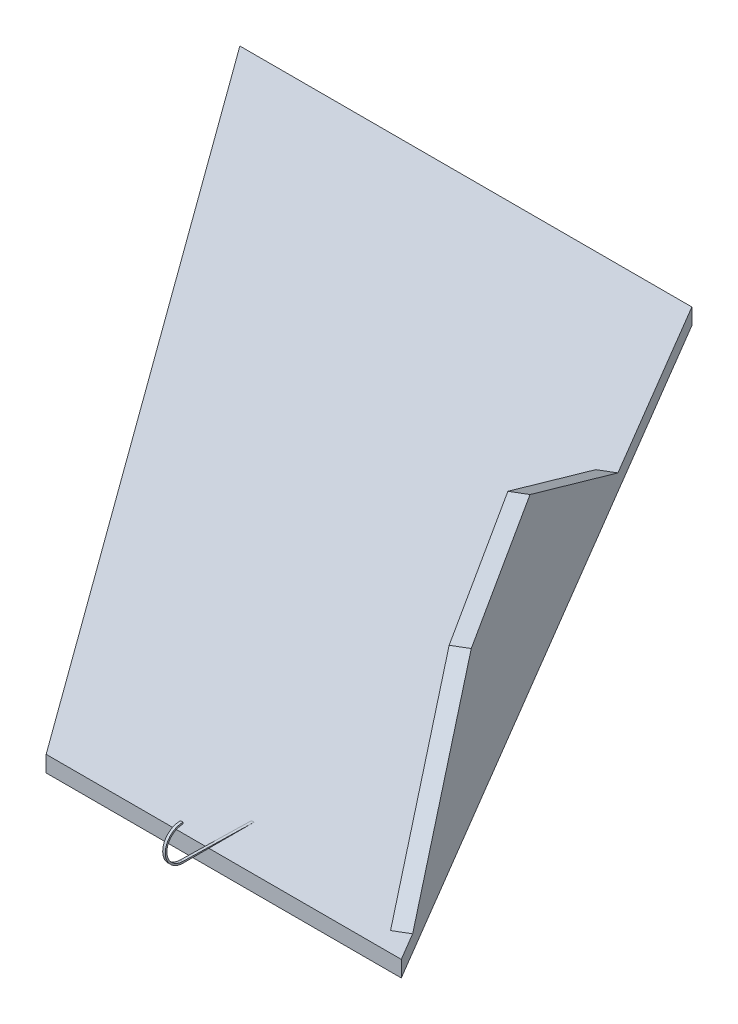
ISO-10303-21;
HEADER;
FILE_DESCRIPTION(('STEP AP214'),'2;1');
FILE_NAME('part.step','',(''),(''),'','','');
FILE_SCHEMA(('AUTOMOTIVE_DESIGN { 1 0 10303 214 1 1 1 1 }'));
ENDSEC;
DATA;
#1=APPLICATION_CONTEXT('core data for automotive mechanical design processes');
#2=APPLICATION_PROTOCOL_DEFINITION('international standard','automotive_design',2000,#1);
#3=PRODUCT_CONTEXT('',#1,'mechanical');
#4=PRODUCT('Part','Part','',(#3));
#5=PRODUCT_RELATED_PRODUCT_CATEGORY('part','',(#4));
#6=PRODUCT_DEFINITION_FORMATION('','',#4);
#7=PRODUCT_DEFINITION_CONTEXT('part definition',#1,'design');
#8=PRODUCT_DEFINITION('design','',#6,#7);
#9=PRODUCT_DEFINITION_SHAPE('','',#8);
#10=(LENGTH_UNIT() NAMED_UNIT(*) SI_UNIT(.MILLI.,.METRE.));
#11=(NAMED_UNIT(*) PLANE_ANGLE_UNIT() SI_UNIT($,.RADIAN.));
#12=(NAMED_UNIT(*) SI_UNIT($,.STERADIAN.) SOLID_ANGLE_UNIT());
#13=UNCERTAINTY_MEASURE_WITH_UNIT(LENGTH_MEASURE(1.E-05),#10,'distance_accuracy_value','');
#14=(GEOMETRIC_REPRESENTATION_CONTEXT(3) GLOBAL_UNCERTAINTY_ASSIGNED_CONTEXT((#13)) GLOBAL_UNIT_ASSIGNED_CONTEXT((#10,
#11,#12)) REPRESENTATION_CONTEXT('',''));
#15=CARTESIAN_POINT('',(0.,0.,0.));
#16=DIRECTION('',(0.,0.,1.));
#17=DIRECTION('',(1.,0.,0.));
#18=AXIS2_PLACEMENT_3D('',#15,#16,#17);
#19=CARTESIAN_POINT('',(0.,6.35,0.));
#20=DIRECTION('',(0.,-1.,0.));
#21=DIRECTION('',(0.,0.,-1.));
#22=AXIS2_PLACEMENT_3D('',#19,#20,#21);
#23=PLANE('',#22);
#24=DIRECTION('',(-0.508729312126642,0.,-0.860926528214315));
#25=VECTOR('',#24,1.);
#26=CARTESIAN_POINT('',(254.155589586524,6.35,-150.182848392037));
#27=LINE('',#26,#25);
#28=CARTESIAN_POINT('',(342.9,6.35000000000002,0.));
#29=VERTEX_POINT('',#28);
#30=CARTESIAN_POINT('',(336.439137735992,6.35,-10.933766908322));
#31=VERTEX_POINT('',#30);
#32=EDGE_CURVE('E180',#29,#31,#27,.T.);
#33=ORIENTED_EDGE('',*,*,#32,.T.);
#34=DIRECTION('',(0.860926528214315,0.,-0.508729312126642));
#35=VECTOR('',#34,1.);
#36=CARTESIAN_POINT('',(330.972254281831,6.35000000000002,-7.70333577631764));
#37=LINE('',#36,#35);
#38=CARTESIAN_POINT('',(330.972254281831,6.35,-7.70333577631765));
#39=VERTEX_POINT('',#38);
#40=EDGE_CURVE('E151',#39,#31,#37,.T.);
#41=ORIENTED_EDGE('',*,*,#40,.F.);
#42=DIRECTION('',(-0.508729312126641,0.,-0.860926528214315));
#43=VECTOR('',#42,1.);
#44=CARTESIAN_POINT('',(330.972254281831,6.35000000000002,-7.70333577631764));
#45=LINE('',#44,#43);
#46=CARTESIAN_POINT('',(214.328721261893,6.35,-205.100083963904));
#47=VERTEX_POINT('',#46);
#48=EDGE_CURVE('E152',#39,#47,#45,.T.);
#49=ORIENTED_EDGE('',*,*,#48,.T.);
#50=DIRECTION('',(0.860926528214315,0.,-0.508729312126642));
#51=VECTOR('',#50,1.);
#52=CARTESIAN_POINT('',(214.328721261893,6.35000000000002,-205.100083963904));
#53=LINE('',#52,#51);
#54=CARTESIAN_POINT('',(219.795604716054,6.35000000000002,-208.330515095908));
#55=VERTEX_POINT('',#54);
#56=EDGE_CURVE('E161',#47,#55,#53,.T.);
#57=ORIENTED_EDGE('',*,*,#56,.T.);
#58=CARTESIAN_POINT('',(177.8,6.35000000000002,-279.4));
#59=VERTEX_POINT('',#58);
#60=EDGE_CURVE('E177',#55,#59,#27,.T.);
#61=ORIENTED_EDGE('',*,*,#60,.T.);
#62=DIRECTION('',(1.,0.,0.));
#63=VECTOR('',#62,1.);
#64=CARTESIAN_POINT('',(0.,6.35,-279.4));
#65=LINE('',#64,#63);
#66=CARTESIAN_POINT('',(0.,6.35000000000002,-279.4));
#67=VERTEX_POINT('',#66);
#68=EDGE_CURVE('E224',#67,#59,#65,.T.);
#69=ORIENTED_EDGE('',*,*,#68,.F.);
#70=DIRECTION('',(0.588171697675046,0.,0.808736084303189));
#71=VECTOR('',#70,1.);
#72=CARTESIAN_POINT('',(132.903783783784,6.35,-96.6572972972973));
#73=LINE('',#72,#71);
#74=CARTESIAN_POINT('',(203.2,6.35000000000002,0.));
#75=VERTEX_POINT('',#74);
#76=EDGE_CURVE('E168',#67,#75,#73,.T.);
#77=ORIENTED_EDGE('',*,*,#76,.T.);
#78=DIRECTION('',(1.,0.,0.));
#79=VECTOR('',#78,1.);
#80=CARTESIAN_POINT('',(0.,6.35,0.));
#81=LINE('',#80,#79);
#82=CARTESIAN_POINT('',(266.192,6.35,0.));
#83=VERTEX_POINT('',#82);
#84=EDGE_CURVE('E229',#75,#83,#81,.T.);
#85=ORIENTED_EDGE('',*,*,#84,.T.);
#86=DIRECTION('',(0.,0.,1.));
#87=VECTOR('',#86,1.);
#88=CARTESIAN_POINT('',(266.192,6.35,-17.78));
#89=LINE('',#88,#87);
#90=CARTESIAN_POINT('',(266.192,6.35,-17.78));
#91=VERTEX_POINT('',#90);
#92=EDGE_CURVE('E185',#91,#83,#89,.T.);
#93=ORIENTED_EDGE('',*,*,#92,.F.);
#94=DIRECTION('',(-1.,0.,0.));
#95=VECTOR('',#94,1.);
#96=CARTESIAN_POINT('',(267.208,6.35,-17.78));
#97=LINE('',#96,#95);
#98=CARTESIAN_POINT('',(267.208,6.35,-17.78));
#99=VERTEX_POINT('',#98);
#100=EDGE_CURVE('E211',#99,#91,#97,.T.);
#101=ORIENTED_EDGE('',*,*,#100,.F.);
#102=DIRECTION('',(0.,0.,1.));
#103=VECTOR('',#102,1.);
#104=CARTESIAN_POINT('',(267.208,6.35,-17.78));
#105=LINE('',#104,#103);
#106=CARTESIAN_POINT('',(267.208,6.35,0.));
#107=VERTEX_POINT('',#106);
#108=EDGE_CURVE('E201',#99,#107,#105,.T.);
#109=ORIENTED_EDGE('',*,*,#108,.T.);
#110=EDGE_CURVE('E227',#107,#29,#81,.T.);
#111=ORIENTED_EDGE('',*,*,#110,.T.);
#112=EDGE_LOOP('',(#33,#41,#49,#57,#61,#69,#77,#85,#93,#101,#109,#111));
#113=FACE_BOUND('',#112,.T.);
#114=ADVANCED_FACE('F37',(#113),#23,.F.);
#115=CARTESIAN_POINT('',(0.,6.35,0.));
#116=DIRECTION('',(0.,0.,-1.));
#117=DIRECTION('',(-1.,0.,0.));
#118=AXIS2_PLACEMENT_3D('',#115,#116,#117);
#119=PLANE('',#118);
#120=ORIENTED_EDGE('',*,*,#84,.F.);
#121=DIRECTION('',(0.,-1.,0.));
#122=VECTOR('',#121,1.);
#123=CARTESIAN_POINT('',(203.2,76.2,0.));
#124=LINE('',#123,#122);
#125=CARTESIAN_POINT('',(203.2,0.,0.));
#126=VERTEX_POINT('',#125);
#127=EDGE_CURVE('E165',#75,#126,#124,.T.);
#128=ORIENTED_EDGE('',*,*,#127,.T.);
#129=DIRECTION('',(1.,0.,0.));
#130=VECTOR('',#129,1.);
#131=CARTESIAN_POINT('',(0.,0.,0.));
#132=LINE('',#131,#130);
#133=CARTESIAN_POINT('',(342.9,0.,0.));
#134=VERTEX_POINT('',#133);
#135=EDGE_CURVE('E228',#126,#134,#132,.T.);
#136=ORIENTED_EDGE('',*,*,#135,.T.);
#137=DIRECTION('',(0.,-1.,0.));
#138=VECTOR('',#137,1.);
#139=CARTESIAN_POINT('',(342.9,76.2,0.));
#140=LINE('',#139,#138);
#141=EDGE_CURVE('E174',#29,#134,#140,.T.);
#142=ORIENTED_EDGE('',*,*,#141,.F.);
#143=ORIENTED_EDGE('',*,*,#110,.F.);
#144=EDGE_CURVE('E231',#83,#107,#81,.T.);
#145=ORIENTED_EDGE('',*,*,#144,.F.);
#146=EDGE_LOOP('',(#120,#128,#136,#142,#143,#145));
#147=FACE_BOUND('',#146,.T.);
#148=ADVANCED_FACE('F251',(#147),#119,.F.);
#149=CARTESIAN_POINT('',(0.,6.35,-279.4));
#150=DIRECTION('',(0.,0.,-1.));
#151=DIRECTION('',(-1.,0.,0.));
#152=AXIS2_PLACEMENT_3D('',#149,#150,#151);
#153=PLANE('',#152);
#154=DIRECTION('',(0.,-1.,0.));
#155=VECTOR('',#154,1.);
#156=CARTESIAN_POINT('',(177.8,76.2,-279.4));
#157=LINE('',#156,#155);
#158=CARTESIAN_POINT('',(177.8,0.,-279.4));
#159=VERTEX_POINT('',#158);
#160=EDGE_CURVE('E173',#59,#159,#157,.T.);
#161=ORIENTED_EDGE('',*,*,#160,.T.);
#162=DIRECTION('',(1.,0.,0.));
#163=VECTOR('',#162,1.);
#164=CARTESIAN_POINT('',(0.,0.,-279.4));
#165=LINE('',#164,#163);
#166=CARTESIAN_POINT('',(0.,0.,-279.4));
#167=VERTEX_POINT('',#166);
#168=EDGE_CURVE('E214',#167,#159,#165,.T.);
#169=ORIENTED_EDGE('',*,*,#168,.F.);
#170=DIRECTION('',(0.,-1.,0.));
#171=VECTOR('',#170,1.);
#172=CARTESIAN_POINT('',(0.,6.35,-279.4));
#173=LINE('',#172,#171);
#174=EDGE_CURVE('E45',#67,#167,#173,.T.);
#175=ORIENTED_EDGE('',*,*,#174,.F.);
#176=ORIENTED_EDGE('',*,*,#68,.T.);
#177=EDGE_LOOP('',(#161,#169,#175,#176));
#178=FACE_BOUND('',#177,.T.);
#179=ADVANCED_FACE('F39',(#178),#153,.T.);
#180=CARTESIAN_POINT('',(0.,0.,0.));
#181=DIRECTION('',(0.,-1.,0.));
#182=DIRECTION('',(0.,0.,-1.));
#183=AXIS2_PLACEMENT_3D('',#180,#181,#182);
#184=PLANE('',#183);
#185=DIRECTION('',(0.588171697675046,0.,0.808736084303189));
#186=VECTOR('',#185,1.);
#187=CARTESIAN_POINT('',(203.2,0.,0.));
#188=LINE('',#187,#186);
#189=EDGE_CURVE('E160',#167,#126,#188,.T.);
#190=ORIENTED_EDGE('',*,*,#189,.F.);
#191=ORIENTED_EDGE('',*,*,#168,.T.);
#192=DIRECTION('',(-0.508729312126642,0.,-0.860926528214315));
#193=VECTOR('',#192,1.);
#194=CARTESIAN_POINT('',(185.55303471681,0.,-266.279479710014));
#195=LINE('',#194,#193);
#196=EDGE_CURVE('E171',#134,#159,#195,.T.);
#197=ORIENTED_EDGE('',*,*,#196,.F.);
#198=ORIENTED_EDGE('',*,*,#135,.F.);
#199=EDGE_LOOP('',(#190,#191,#197,#198));
#200=FACE_BOUND('',#199,.T.);
#201=ADVANCED_FACE('F243',(#200),#184,.T.);
#202=CARTESIAN_POINT('',(267.208,6.35,0.));
#203=DIRECTION('',(0.,-1.,0.));
#204=DIRECTION('',(0.,0.,-1.));
#205=AXIS2_PLACEMENT_3D('',#202,#203,#204);
#206=PLANE('',#205);
#207=ORIENTED_EDGE('',*,*,#144,.T.);
#208=CARTESIAN_POINT('',(267.208,6.35,10.16));
#209=VERTEX_POINT('',#208);
#210=EDGE_CURVE('E200',#107,#209,#105,.T.);
#211=ORIENTED_EDGE('',*,*,#210,.T.);
#212=DIRECTION('',(-1.,0.,0.));
#213=VECTOR('',#212,1.);
#214=CARTESIAN_POINT('',(267.208,6.35,10.16));
#215=LINE('',#214,#213);
#216=CARTESIAN_POINT('',(266.192,6.35,10.16));
#217=VERTEX_POINT('',#216);
#218=EDGE_CURVE('E219',#209,#217,#215,.T.);
#219=ORIENTED_EDGE('',*,*,#218,.T.);
#220=EDGE_CURVE('E184',#83,#217,#89,.T.);
#221=ORIENTED_EDGE('',*,*,#220,.F.);
#222=EDGE_LOOP('',(#207,#211,#219,#221));
#223=FACE_BOUND('',#222,.T.);
#224=ADVANCED_FACE('F258',(#223),#206,.T.);
#225=CARTESIAN_POINT('',(267.208,6.98663093519674,10.303910448019));
#226=DIRECTION('',(0.,0.999743159811537,-0.0226630626801568));
#227=DIRECTION('',(0.,0.0226630626801568,0.999743159811537));
#228=AXIS2_PLACEMENT_3D('',#225,#226,#227);
#229=PLANE('',#228);
#230=ORIENTED_EDGE('',*,*,#100,.T.);
#231=DIRECTION('',(0.,-0.0226630626801568,-0.999743159811536));
#232=VECTOR('',#231,1.);
#233=CARTESIAN_POINT('',(266.192,6.98663093519674,10.303910448019));
#234=LINE('',#233,#232);
#235=CARTESIAN_POINT('',(266.192,6.98663093519674,10.303910448019));
#236=VERTEX_POINT('',#235);
#237=EDGE_CURVE('E182',#236,#91,#234,.T.);
#238=ORIENTED_EDGE('',*,*,#237,.F.);
#239=DIRECTION('',(-1.,0.,0.));
#240=VECTOR('',#239,1.);
#241=CARTESIAN_POINT('',(267.208,6.98663093519674,10.303910448019));
#242=LINE('',#241,#240);
#243=CARTESIAN_POINT('',(267.208,6.98663093519674,10.303910448019));
#244=VERTEX_POINT('',#243);
#245=EDGE_CURVE('E212',#244,#236,#242,.T.);
#246=ORIENTED_EDGE('',*,*,#245,.F.);
#247=DIRECTION('',(0.,-0.0226630626801568,-0.999743159811536));
#248=VECTOR('',#247,1.);
#249=CARTESIAN_POINT('',(267.208,6.98663093519674,10.303910448019));
#250=LINE('',#249,#248);
#251=EDGE_CURVE('E197',#244,#99,#250,.T.);
#252=ORIENTED_EDGE('',*,*,#251,.T.);
#253=EDGE_LOOP('',(#230,#238,#246,#252));
#254=FACE_BOUND('',#253,.T.);
#255=ADVANCED_FACE('F282',(#254),#229,.T.);
#256=CARTESIAN_POINT('',(267.208,13.335,10.16));
#257=DIRECTION('',(-1.,0.,0.));
#258=DIRECTION('',(0.,0.,1.));
#259=AXIS2_PLACEMENT_3D('',#256,#257,#258);
#260=CYLINDRICAL_SURFACE('',#259,6.35);
#261=ORIENTED_EDGE('',*,*,#245,.T.);
#262=CARTESIAN_POINT('',(266.192,13.335,10.16));
#263=DIRECTION('',(-1.,0.,0.));
#264=DIRECTION('',(0.,0.,1.));
#265=AXIS2_PLACEMENT_3D('',#262,#263,#264);
#266=CIRCLE('',#265,6.35);
#267=CARTESIAN_POINT('',(266.192,19.685,10.16));
#268=VERTEX_POINT('',#267);
#269=EDGE_CURVE('E194',#236,#268,#266,.T.);
#270=ORIENTED_EDGE('',*,*,#269,.T.);
#271=DIRECTION('',(-1.,0.,0.));
#272=VECTOR('',#271,1.);
#273=CARTESIAN_POINT('',(267.208,19.685,10.16));
#274=LINE('',#273,#272);
#275=CARTESIAN_POINT('',(267.208,19.685,10.16));
#276=VERTEX_POINT('',#275);
#277=EDGE_CURVE('E215',#276,#268,#274,.T.);
#278=ORIENTED_EDGE('',*,*,#277,.F.);
#279=CARTESIAN_POINT('',(267.208,13.335,10.16));
#280=DIRECTION('',(-1.,0.,0.));
#281=DIRECTION('',(0.,0.,1.));
#282=AXIS2_PLACEMENT_3D('',#279,#280,#281);
#283=CIRCLE('',#282,6.35);
#284=EDGE_CURVE('E209',#244,#276,#283,.T.);
#285=ORIENTED_EDGE('',*,*,#284,.F.);
#286=EDGE_LOOP('',(#261,#270,#278,#285));
#287=FACE_BOUND('',#286,.T.);
#288=ADVANCED_FACE('F278',(#287),#260,.F.);
#289=CARTESIAN_POINT('',(267.208,19.685,10.16));
#290=DIRECTION('',(0.,0.,1.));
#291=DIRECTION('',(1.,0.,0.));
#292=AXIS2_PLACEMENT_3D('',#289,#290,#291);
#293=PLANE('',#292);
#294=ORIENTED_EDGE('',*,*,#277,.T.);
#295=DIRECTION('',(0.,1.,0.));
#296=VECTOR('',#295,1.);
#297=CARTESIAN_POINT('',(266.192,19.685,10.16));
#298=LINE('',#297,#296);
#299=CARTESIAN_POINT('',(266.192,20.32,10.16));
#300=VERTEX_POINT('',#299);
#301=EDGE_CURVE('E191',#268,#300,#298,.T.);
#302=ORIENTED_EDGE('',*,*,#301,.T.);
#303=DIRECTION('',(-1.,0.,0.));
#304=VECTOR('',#303,1.);
#305=CARTESIAN_POINT('',(267.208,20.32,10.16));
#306=LINE('',#305,#304);
#307=CARTESIAN_POINT('',(267.208,20.32,10.16));
#308=VERTEX_POINT('',#307);
#309=EDGE_CURVE('E217',#308,#300,#306,.T.);
#310=ORIENTED_EDGE('',*,*,#309,.F.);
#311=DIRECTION('',(0.,1.,0.));
#312=VECTOR('',#311,1.);
#313=CARTESIAN_POINT('',(267.208,19.685,10.16));
#314=LINE('',#313,#312);
#315=EDGE_CURVE('E207',#276,#308,#314,.T.);
#316=ORIENTED_EDGE('',*,*,#315,.F.);
#317=EDGE_LOOP('',(#294,#302,#310,#316));
#318=FACE_BOUND('',#317,.T.);
#319=ADVANCED_FACE('F274',(#318),#293,.F.);
#320=CARTESIAN_POINT('',(267.208,13.335,10.16));
#321=DIRECTION('',(-1.,0.,0.));
#322=DIRECTION('',(0.,0.,1.));
#323=AXIS2_PLACEMENT_3D('',#320,#321,#322);
#324=CYLINDRICAL_SURFACE('',#323,6.985);
#325=ORIENTED_EDGE('',*,*,#309,.T.);
#326=CARTESIAN_POINT('',(266.192,13.335,10.16));
#327=DIRECTION('',(-1.,0.,0.));
#328=DIRECTION('',(0.,0.,1.));
#329=AXIS2_PLACEMENT_3D('',#326,#327,#328);
#330=CIRCLE('',#329,6.985);
#331=EDGE_CURVE('E188',#217,#300,#330,.T.);
#332=ORIENTED_EDGE('',*,*,#331,.F.);
#333=ORIENTED_EDGE('',*,*,#218,.F.);
#334=CARTESIAN_POINT('',(267.208,13.335,10.16));
#335=DIRECTION('',(-1.,0.,0.));
#336=DIRECTION('',(0.,0.,1.));
#337=AXIS2_PLACEMENT_3D('',#334,#335,#336);
#338=CIRCLE('',#337,6.985);
#339=EDGE_CURVE('E204',#209,#308,#338,.T.);
#340=ORIENTED_EDGE('',*,*,#339,.T.);
#341=EDGE_LOOP('',(#325,#332,#333,#340));
#342=FACE_BOUND('',#341,.T.);
#343=ADVANCED_FACE('F267',(#342),#324,.T.);
#344=CARTESIAN_POINT('',(267.208,13.335,10.16));
#345=DIRECTION('',(-1.,0.,0.));
#346=DIRECTION('',(0.,0.,1.));
#347=AXIS2_PLACEMENT_3D('',#344,#345,#346);
#348=PLANE('',#347);
#349=ORIENTED_EDGE('',*,*,#251,.F.);
#350=ORIENTED_EDGE('',*,*,#284,.T.);
#351=ORIENTED_EDGE('',*,*,#315,.T.);
#352=ORIENTED_EDGE('',*,*,#339,.F.);
#353=ORIENTED_EDGE('',*,*,#210,.F.);
#354=ORIENTED_EDGE('',*,*,#108,.F.);
#355=EDGE_LOOP('',(#349,#350,#351,#352,#353,#354));
#356=FACE_BOUND('',#355,.T.);
#357=ADVANCED_FACE('F263',(#356),#348,.F.);
#358=CARTESIAN_POINT('',(266.192,13.335,10.16));
#359=DIRECTION('',(-1.,0.,0.));
#360=DIRECTION('',(0.,0.,1.));
#361=AXIS2_PLACEMENT_3D('',#358,#359,#360);
#362=PLANE('',#361);
#363=ORIENTED_EDGE('',*,*,#237,.T.);
#364=ORIENTED_EDGE('',*,*,#92,.T.);
#365=ORIENTED_EDGE('',*,*,#220,.T.);
#366=ORIENTED_EDGE('',*,*,#331,.T.);
#367=ORIENTED_EDGE('',*,*,#301,.F.);
#368=ORIENTED_EDGE('',*,*,#269,.F.);
#369=EDGE_LOOP('',(#363,#364,#365,#366,#367,#368));
#370=FACE_BOUND('',#369,.T.);
#371=ADVANCED_FACE('F271',(#370),#362,.T.);
#372=CARTESIAN_POINT('',(185.55303471681,76.2,-266.279479710014));
#373=DIRECTION('',(-0.860926528214315,0.,0.508729312126642));
#374=DIRECTION('',(0.508729312126642,0.,0.860926528214315));
#375=AXIS2_PLACEMENT_3D('',#372,#373,#374);
#376=PLANE('',#375);
#377=DIRECTION('',(0.434349186245985,0.52061372645936,0.735052469031666));
#378=VECTOR('',#377,1.);
#379=CARTESIAN_POINT('',(285.990420699942,85.6915319124065,-96.3085188154823));
#380=LINE('',#379,#378);
#381=CARTESIAN_POINT('',(269.765543192928,66.2442894453982,-123.766003827353));
#382=VERTEX_POINT('',#381);
#383=EDGE_CURVE('E148',#55,#382,#380,.T.);
#384=ORIENTED_EDGE('',*,*,#383,.T.);
#385=DIRECTION('',(-0.505412496960497,0.11400482106617,-0.855313456394687));
#386=VECTOR('',#385,1.);
#387=CARTESIAN_POINT('',(303.142984492199,58.7154110621883,-67.2811031670477));
#388=LINE('',#387,#386);
#389=CARTESIAN_POINT('',(303.142984492199,58.7154110621883,-67.2811031670477));
#390=VERTEX_POINT('',#389);
#391=EDGE_CURVE('E139',#390,#382,#388,.T.);
#392=ORIENTED_EDGE('',*,*,#391,.F.);
#393=DIRECTION('',(0.397233992409838,-0.624736471751232,0.672242141001264));
#394=VECTOR('',#393,1.);
#395=CARTESIAN_POINT('',(336.439137735992,6.35000000000002,-10.9337669083218));
#396=LINE('',#395,#394);
#397=EDGE_CURVE('E145',#390,#31,#396,.T.);
#398=ORIENTED_EDGE('',*,*,#397,.T.);
#399=ORIENTED_EDGE('',*,*,#32,.F.);
#400=ORIENTED_EDGE('',*,*,#141,.T.);
#401=ORIENTED_EDGE('',*,*,#196,.T.);
#402=ORIENTED_EDGE('',*,*,#160,.F.);
#403=ORIENTED_EDGE('',*,*,#60,.F.);
#404=EDGE_LOOP('',(#384,#392,#398,#399,#400,#401,#402,#403));
#405=FACE_BOUND('',#404,.T.);
#406=ADVANCED_FACE('F144',(#405),#376,.F.);
#407=CARTESIAN_POINT('',(203.2,76.2,0.));
#408=DIRECTION('',(0.808736084303188,0.,-0.588171697675046));
#409=DIRECTION('',(-0.588171697675046,0.,-0.808736084303189));
#410=AXIS2_PLACEMENT_3D('',#407,#408,#409);
#411=PLANE('',#410);
#412=ORIENTED_EDGE('',*,*,#174,.T.);
#413=ORIENTED_EDGE('',*,*,#189,.T.);
#414=ORIENTED_EDGE('',*,*,#127,.F.);
#415=ORIENTED_EDGE('',*,*,#76,.F.);
#416=EDGE_LOOP('',(#412,#413,#414,#415));
#417=FACE_BOUND('',#416,.T.);
#418=ADVANCED_FACE('F237',(#417),#411,.F.);
#419=CARTESIAN_POINT('',(330.972254281831,6.35000000000002,-7.70333577631764));
#420=DIRECTION('',(0.317821755534429,0.780835668283552,0.537852201673649));
#421=DIRECTION('',(0.,-0.567264599156606,0.823535593974963));
#422=AXIS2_PLACEMENT_3D('',#419,#420,#421);
#423=PLANE('',#422);
#424=DIRECTION('',(0.860926528214315,0.,-0.508729312126642));
#425=VECTOR('',#424,1.);
#426=CARTESIAN_POINT('',(283.024853380887,58.7154110621883,-55.3931166012724));
#427=LINE('',#426,#425);
#428=CARTESIAN_POINT('',(297.676101038038,58.7154110621883,-64.0506720350436));
#429=VERTEX_POINT('',#428);
#430=EDGE_CURVE('E136',#429,#390,#427,.T.);
#431=ORIENTED_EDGE('',*,*,#430,.F.);
#432=DIRECTION('',(0.397233992409838,-0.624736471751232,0.672242141001264));
#433=VECTOR('',#432,1.);
#434=CARTESIAN_POINT('',(330.972254281831,6.35000000000002,-7.70333577631764));
#435=LINE('',#434,#433);
#436=EDGE_CURVE('E59',#429,#39,#435,.T.);
#437=ORIENTED_EDGE('',*,*,#436,.T.);
#438=ORIENTED_EDGE('',*,*,#40,.T.);
#439=ORIENTED_EDGE('',*,*,#397,.F.);
#440=EDGE_LOOP('',(#431,#437,#438,#439));
#441=FACE_BOUND('',#440,.T.);
#442=ADVANCED_FACE('F150',(#441),#423,.T.);
#443=CARTESIAN_POINT('',(280.523537245781,85.6915319124065,-93.0780876834781));
#444=DIRECTION('',(-0.264851462945358,0.85379233296048,-0.448210168061374));
#445=DIRECTION('',(0.,0.464808854126127,0.885411050939594));
#446=AXIS2_PLACEMENT_3D('',#443,#444,#445);
#447=PLANE('',#446);
#448=DIRECTION('',(0.860926528214315,0.,-0.508729312126642));
#449=VECTOR('',#448,1.);
#450=CARTESIAN_POINT('',(249.647412081616,66.2442894453982,-111.878017261577));
#451=LINE('',#450,#449);
#452=CARTESIAN_POINT('',(264.298659738767,66.2442894453982,-120.535572695349));
#453=VERTEX_POINT('',#452);
#454=EDGE_CURVE('E52',#453,#382,#451,.T.);
#455=ORIENTED_EDGE('',*,*,#454,.T.);
#456=ORIENTED_EDGE('',*,*,#383,.F.);
#457=ORIENTED_EDGE('',*,*,#56,.F.);
#458=DIRECTION('',(0.434349186245985,0.52061372645936,0.735052469031666));
#459=VECTOR('',#458,1.);
#460=CARTESIAN_POINT('',(280.523537245781,85.6915319124065,-93.0780876834781));
#461=LINE('',#460,#459);
#462=EDGE_CURVE('E154',#47,#453,#461,.T.);
#463=ORIENTED_EDGE('',*,*,#462,.T.);
#464=EDGE_LOOP('',(#455,#456,#457,#463));
#465=FACE_BOUND('',#464,.T.);
#466=ADVANCED_FACE('F288',(#465),#447,.T.);
#467=CARTESIAN_POINT('',(248.688706132363,0.,-146.952417260033));
#468=DIRECTION('',(0.860926528214315,0.,-0.508729312126642));
#469=DIRECTION('',(-0.508729312126642,0.,-0.860926528214315));
#470=AXIS2_PLACEMENT_3D('',#467,#468,#469);
#471=PLANE('',#470);
#472=ORIENTED_EDGE('',*,*,#436,.F.);
#473=DIRECTION('',(-0.505412496960497,0.11400482106617,-0.855313456394687));
#474=VECTOR('',#473,1.);
#475=CARTESIAN_POINT('',(252.708550519063,68.8586457101841,-140.14960368254));
#476=LINE('',#475,#474);
#477=EDGE_CURVE('E11',#429,#453,#476,.T.);
#478=ORIENTED_EDGE('',*,*,#477,.T.);
#479=ORIENTED_EDGE('',*,*,#462,.F.);
#480=ORIENTED_EDGE('',*,*,#48,.F.);
#481=EDGE_LOOP('',(#472,#478,#479,#480));
#482=FACE_BOUND('',#481,.T.);
#483=ADVANCED_FACE('F292',(#482),#471,.F.);
#484=CARTESIAN_POINT('',(283.024853380887,58.7154110621883,-55.3931166012724));
#485=DIRECTION('',(-0.0579975942001137,-0.993480196467786,-0.0981497748001924));
#486=DIRECTION('',(0.,0.0983152666447381,-0.995155318703857));
#487=AXIS2_PLACEMENT_3D('',#484,#485,#486);
#488=PLANE('',#487);
#489=ORIENTED_EDGE('',*,*,#430,.T.);
#490=ORIENTED_EDGE('',*,*,#391,.T.);
#491=ORIENTED_EDGE('',*,*,#454,.F.);
#492=ORIENTED_EDGE('',*,*,#477,.F.);
#493=EDGE_LOOP('',(#489,#490,#491,#492));
#494=FACE_BOUND('',#493,.T.);
#495=ADVANCED_FACE('F138',(#494),#488,.F.);
#496=CLOSED_SHELL('',(#114,#148,#179,#201,#224,#255,#288,#319,#343,#357,#371,#406,#418,#442,
#466,#483,#495));
#497=MANIFOLD_SOLID_BREP('B2',#496);
#498=ADVANCED_BREP_SHAPE_REPRESENTATION('',(#18,#497),#14);
#499=SHAPE_DEFINITION_REPRESENTATION(#9,#498);
ENDSEC;
END-ISO-10303-21;
